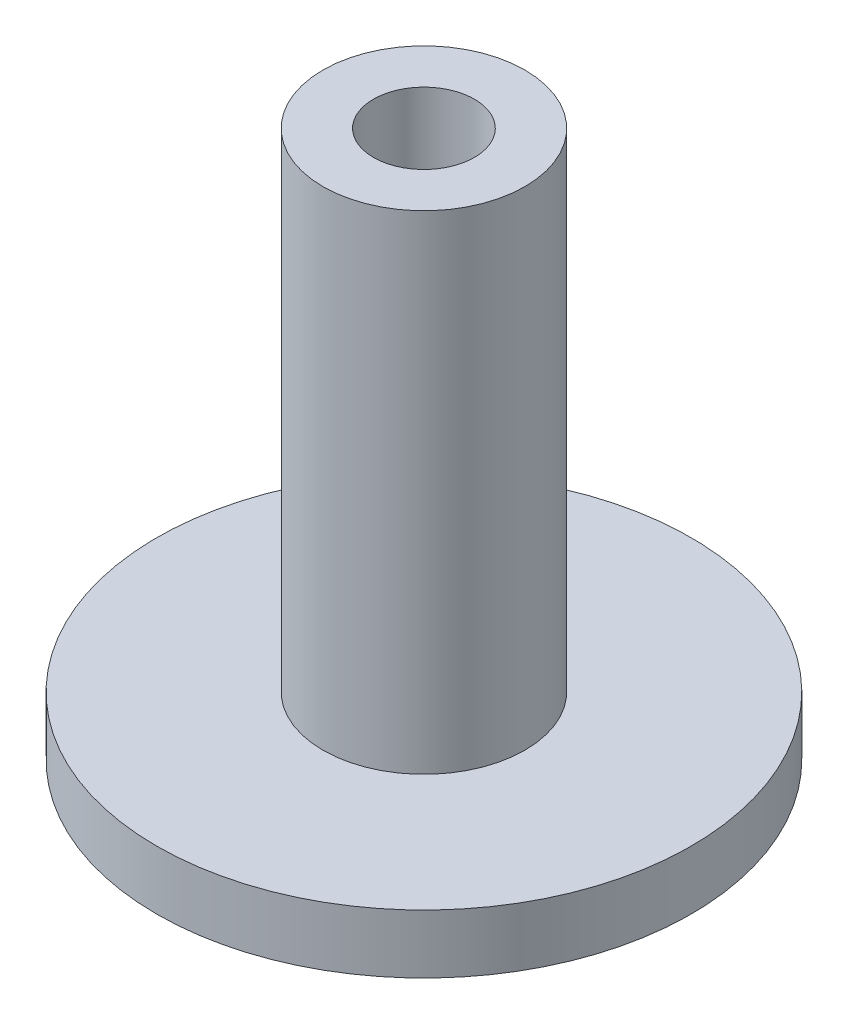
ISO-10303-21;
HEADER;
FILE_DESCRIPTION(('STEP AP214'),'2;1');
FILE_NAME('part.step','',(''),(''),'','','');
FILE_SCHEMA(('AUTOMOTIVE_DESIGN { 1 0 10303 214 1 1 1 1 }'));
ENDSEC;
DATA;
#1=APPLICATION_CONTEXT('core data for automotive mechanical design processes');
#2=APPLICATION_PROTOCOL_DEFINITION('international standard','automotive_design',2000,#1);
#3=PRODUCT_CONTEXT('',#1,'mechanical');
#4=PRODUCT('Part','Part','',(#3));
#5=PRODUCT_RELATED_PRODUCT_CATEGORY('part','',(#4));
#6=PRODUCT_DEFINITION_FORMATION('','',#4);
#7=PRODUCT_DEFINITION_CONTEXT('part definition',#1,'design');
#8=PRODUCT_DEFINITION('design','',#6,#7);
#9=PRODUCT_DEFINITION_SHAPE('','',#8);
#10=(LENGTH_UNIT() NAMED_UNIT(*) SI_UNIT(.MILLI.,.METRE.));
#11=(NAMED_UNIT(*) PLANE_ANGLE_UNIT() SI_UNIT($,.RADIAN.));
#12=(NAMED_UNIT(*) SI_UNIT($,.STERADIAN.) SOLID_ANGLE_UNIT());
#13=UNCERTAINTY_MEASURE_WITH_UNIT(LENGTH_MEASURE(1.E-05),#10,'distance_accuracy_value','');
#14=(GEOMETRIC_REPRESENTATION_CONTEXT(3) GLOBAL_UNCERTAINTY_ASSIGNED_CONTEXT((#13)) GLOBAL_UNIT_ASSIGNED_CONTEXT((#10,
#11,#12)) REPRESENTATION_CONTEXT('',''));
#15=CARTESIAN_POINT('',(0.,0.,0.));
#16=DIRECTION('',(0.,0.,1.));
#17=DIRECTION('',(1.,0.,0.));
#18=AXIS2_PLACEMENT_3D('',#15,#16,#17);
#19=CARTESIAN_POINT('',(0.,1.4,0.));
#20=DIRECTION('',(0.,-1.,0.));
#21=DIRECTION('',(0.,0.,-1.));
#22=AXIS2_PLACEMENT_3D('',#19,#20,#21);
#23=CYLINDRICAL_SURFACE('',#22,6.35);
#24=CARTESIAN_POINT('',(0.,1.4,0.));
#25=DIRECTION('',(0.,1.,0.));
#26=DIRECTION('',(0.,0.,1.));
#27=AXIS2_PLACEMENT_3D('',#24,#25,#26);
#28=CIRCLE('',#27,6.35);
#29=CARTESIAN_POINT('',(0.,1.4,6.35));
#30=VERTEX_POINT('',#29);
#31=EDGE_CURVE('E37',#30,#30,#28,.T.);
#32=ORIENTED_EDGE('',*,*,#31,.F.);
#33=EDGE_LOOP('',(#32));
#34=FACE_BOUND('',#33,.T.);
#35=CARTESIAN_POINT('',(0.,0.,0.));
#36=DIRECTION('',(0.,1.,0.));
#37=DIRECTION('',(0.,0.,1.));
#38=AXIS2_PLACEMENT_3D('',#35,#36,#37);
#39=CIRCLE('',#38,6.35);
#40=CARTESIAN_POINT('',(0.,0.,6.35));
#41=VERTEX_POINT('',#40);
#42=EDGE_CURVE('E33',#41,#41,#39,.T.);
#43=ORIENTED_EDGE('',*,*,#42,.T.);
#44=EDGE_LOOP('',(#43));
#45=FACE_BOUND('',#44,.T.);
#46=ADVANCED_FACE('F30',(#34,#45),#23,.T.);
#47=CARTESIAN_POINT('',(0.,1.4,0.));
#48=DIRECTION('',(0.,1.,0.));
#49=DIRECTION('',(0.,0.,1.));
#50=AXIS2_PLACEMENT_3D('',#47,#48,#49);
#51=PLANE('',#50);
#52=CARTESIAN_POINT('',(0.,1.4,0.));
#53=DIRECTION('',(0.,1.,0.));
#54=DIRECTION('',(0.,0.,1.));
#55=AXIS2_PLACEMENT_3D('',#52,#53,#54);
#56=CIRCLE('',#55,2.4);
#57=CARTESIAN_POINT('',(0.,1.4,2.4));
#58=VERTEX_POINT('',#57);
#59=EDGE_CURVE('E10',#58,#58,#56,.T.);
#60=ORIENTED_EDGE('',*,*,#59,.F.);
#61=EDGE_LOOP('',(#60));
#62=FACE_BOUND('',#61,.T.);
#63=ORIENTED_EDGE('',*,*,#31,.T.);
#64=EDGE_LOOP('',(#63));
#65=FACE_BOUND('',#64,.T.);
#66=ADVANCED_FACE('F74',(#62,#65),#51,.T.);
#67=CARTESIAN_POINT('',(0.,0.,0.));
#68=DIRECTION('',(0.,1.,0.));
#69=DIRECTION('',(0.,0.,1.));
#70=AXIS2_PLACEMENT_3D('',#67,#68,#69);
#71=PLANE('',#70);
#72=CARTESIAN_POINT('',(0.,0.,0.));
#73=DIRECTION('',(0.,1.,0.));
#74=DIRECTION('',(0.,0.,1.));
#75=AXIS2_PLACEMENT_3D('',#72,#73,#74);
#76=CIRCLE('',#75,1.2);
#77=CARTESIAN_POINT('',(0.,0.,1.2));
#78=VERTEX_POINT('',#77);
#79=EDGE_CURVE('E46',#78,#78,#76,.T.);
#80=ORIENTED_EDGE('',*,*,#79,.T.);
#81=EDGE_LOOP('',(#80));
#82=FACE_BOUND('',#81,.T.);
#83=ORIENTED_EDGE('',*,*,#42,.F.);
#84=EDGE_LOOP('',(#83));
#85=FACE_BOUND('',#84,.T.);
#86=ADVANCED_FACE('F53',(#82,#85),#71,.F.);
#87=CARTESIAN_POINT('',(0.,13.,0.));
#88=DIRECTION('',(0.,-1.,0.));
#89=DIRECTION('',(0.,0.,-1.));
#90=AXIS2_PLACEMENT_3D('',#87,#88,#89);
#91=CYLINDRICAL_SURFACE('',#90,2.4);
#92=CARTESIAN_POINT('',(0.,13.,0.));
#93=DIRECTION('',(0.,1.,0.));
#94=DIRECTION('',(0.,0.,1.));
#95=AXIS2_PLACEMENT_3D('',#92,#93,#94);
#96=CIRCLE('',#95,2.4);
#97=CARTESIAN_POINT('',(0.,13.,2.4));
#98=VERTEX_POINT('',#97);
#99=EDGE_CURVE('E43',#98,#98,#96,.T.);
#100=ORIENTED_EDGE('',*,*,#99,.F.);
#101=EDGE_LOOP('',(#100));
#102=FACE_BOUND('',#101,.T.);
#103=ORIENTED_EDGE('',*,*,#59,.T.);
#104=EDGE_LOOP('',(#103));
#105=FACE_BOUND('',#104,.T.);
#106=ADVANCED_FACE('F65',(#102,#105),#91,.T.);
#107=CARTESIAN_POINT('',(0.,13.,0.));
#108=DIRECTION('',(0.,1.,0.));
#109=DIRECTION('',(0.,0.,1.));
#110=AXIS2_PLACEMENT_3D('',#107,#108,#109);
#111=PLANE('',#110);
#112=CARTESIAN_POINT('',(0.,13.,0.));
#113=DIRECTION('',(0.,1.,0.));
#114=DIRECTION('',(0.,0.,1.));
#115=AXIS2_PLACEMENT_3D('',#112,#113,#114);
#116=CIRCLE('',#115,1.2);
#117=CARTESIAN_POINT('',(0.,13.,1.2));
#118=VERTEX_POINT('',#117);
#119=EDGE_CURVE('E47',#118,#118,#116,.T.);
#120=ORIENTED_EDGE('',*,*,#119,.F.);
#121=EDGE_LOOP('',(#120));
#122=FACE_BOUND('',#121,.T.);
#123=ORIENTED_EDGE('',*,*,#99,.T.);
#124=EDGE_LOOP('',(#123));
#125=FACE_BOUND('',#124,.T.);
#126=ADVANCED_FACE('F59',(#122,#125),#111,.T.);
#127=CARTESIAN_POINT('',(0.,0.,0.));
#128=DIRECTION('',(0.,1.,0.));
#129=DIRECTION('',(0.,0.,1.));
#130=AXIS2_PLACEMENT_3D('',#127,#128,#129);
#131=CYLINDRICAL_SURFACE('',#130,1.2);
#132=CARTESIAN_POINT('',(0.,0.,1.2));
#133=CARTESIAN_POINT('',(0.,0.135416666666666,1.2));
#134=CARTESIAN_POINT('',(0.,0.270833333333333,1.2));
#135=CARTESIAN_POINT('',(0.,0.541666666666667,1.2));
#136=CARTESIAN_POINT('',(0.,0.677083333333333,1.2));
#137=CARTESIAN_POINT('',(0.,0.947916666666667,1.2));
#138=CARTESIAN_POINT('',(0.,1.08333333333333,1.2));
#139=CARTESIAN_POINT('',(0.,1.35416666666667,1.2));
#140=CARTESIAN_POINT('',(0.,1.48958333333333,1.2));
#141=CARTESIAN_POINT('',(0.,1.76041666666667,1.2));
#142=CARTESIAN_POINT('',(0.,1.89583333333333,1.2));
#143=CARTESIAN_POINT('',(0.,2.16666666666667,1.2));
#144=CARTESIAN_POINT('',(0.,2.30208333333333,1.2));
#145=CARTESIAN_POINT('',(0.,2.57291666666667,1.2));
#146=CARTESIAN_POINT('',(0.,2.70833333333333,1.2));
#147=CARTESIAN_POINT('',(0.,2.97916666666667,1.2));
#148=CARTESIAN_POINT('',(0.,3.11458333333333,1.2));
#149=CARTESIAN_POINT('',(0.,3.38541666666667,1.2));
#150=CARTESIAN_POINT('',(0.,3.52083333333333,1.2));
#151=CARTESIAN_POINT('',(0.,3.79166666666667,1.2));
#152=CARTESIAN_POINT('',(0.,3.92708333333333,1.2));
#153=CARTESIAN_POINT('',(0.,4.19791666666667,1.2));
#154=CARTESIAN_POINT('',(0.,4.33333333333333,1.2));
#155=CARTESIAN_POINT('',(0.,4.60416666666667,1.2));
#156=CARTESIAN_POINT('',(0.,4.73958333333333,1.2));
#157=CARTESIAN_POINT('',(0.,5.01041666666667,1.2));
#158=CARTESIAN_POINT('',(0.,5.14583333333333,1.2));
#159=CARTESIAN_POINT('',(0.,5.41666666666667,1.2));
#160=CARTESIAN_POINT('',(0.,5.55208333333333,1.2));
#161=CARTESIAN_POINT('',(0.,5.82291666666667,1.2));
#162=CARTESIAN_POINT('',(0.,5.95833333333333,1.2));
#163=CARTESIAN_POINT('',(0.,6.22916666666667,1.2));
#164=CARTESIAN_POINT('',(0.,6.36458333333333,1.2));
#165=CARTESIAN_POINT('',(0.,6.63541666666667,1.2));
#166=CARTESIAN_POINT('',(0.,6.77083333333333,1.2));
#167=CARTESIAN_POINT('',(0.,7.04166666666667,1.2));
#168=CARTESIAN_POINT('',(0.,7.17708333333333,1.2));
#169=CARTESIAN_POINT('',(0.,7.44791666666667,1.2));
#170=CARTESIAN_POINT('',(0.,7.58333333333333,1.2));
#171=CARTESIAN_POINT('',(0.,7.85416666666667,1.2));
#172=CARTESIAN_POINT('',(0.,7.98958333333333,1.2));
#173=CARTESIAN_POINT('',(0.,8.26041666666667,1.2));
#174=CARTESIAN_POINT('',(0.,8.39583333333333,1.2));
#175=CARTESIAN_POINT('',(0.,8.66666666666667,1.2));
#176=CARTESIAN_POINT('',(0.,8.80208333333333,1.2));
#177=CARTESIAN_POINT('',(0.,9.07291666666667,1.2));
#178=CARTESIAN_POINT('',(0.,9.20833333333333,1.2));
#179=CARTESIAN_POINT('',(0.,9.47916666666667,1.2));
#180=CARTESIAN_POINT('',(0.,9.61458333333333,1.2));
#181=CARTESIAN_POINT('',(0.,9.88541666666667,1.2));
#182=CARTESIAN_POINT('',(0.,10.0208333333333,1.2));
#183=CARTESIAN_POINT('',(0.,10.2916666666667,1.2));
#184=CARTESIAN_POINT('',(0.,10.4270833333333,1.2));
#185=CARTESIAN_POINT('',(0.,10.6979166666667,1.2));
#186=CARTESIAN_POINT('',(0.,10.8333333333333,1.2));
#187=CARTESIAN_POINT('',(0.,11.1041666666667,1.2));
#188=CARTESIAN_POINT('',(0.,11.2395833333333,1.2));
#189=CARTESIAN_POINT('',(0.,11.5104166666667,1.2));
#190=CARTESIAN_POINT('',(0.,11.6458333333333,1.2));
#191=CARTESIAN_POINT('',(0.,11.9166666666667,1.2));
#192=CARTESIAN_POINT('',(0.,12.0520833333333,1.2));
#193=CARTESIAN_POINT('',(0.,12.3229166666667,1.2));
#194=CARTESIAN_POINT('',(0.,12.4583333333333,1.2));
#195=CARTESIAN_POINT('',(0.,12.7291666666667,1.2));
#196=CARTESIAN_POINT('',(0.,12.8645833333333,1.2));
#197=CARTESIAN_POINT('',(0.,13.,1.2));
#198=B_SPLINE_CURVE_WITH_KNOTS('',3,(#132,#133,#134,#135,#136,#137,#138,#139,#140,#141,#142,
#143,#144,#145,#146,#147,#148,#149,#150,#151,#152,#153,#154,#155,#156,#157,#158,#159,#160,#161,
#162,#163,#164,#165,#166,#167,#168,#169,#170,#171,#172,#173,#174,#175,#176,#177,#178,#179,#180,
#181,#182,#183,#184,#185,#186,#187,#188,#189,#190,#191,#192,#193,#194,#195,#196,#197),
.UNSPECIFIED.,.F.,.F.,(4,2,2,2,2,2,2,2,2,2,2,2,2,2,2,2,2,2,2,2,2,2,2,2,2,2,2,2,2,2,2,2,4),(0.,
0.40625,0.8125,1.21875,1.625,2.03125,2.4375,2.84375,3.25,3.65625,4.0625,4.46875,4.875,5.28125,
5.6875,6.09375,6.5,6.90625,7.3125,7.71875,8.125,8.53125,8.9375,9.34375,9.75,10.15625,10.5625,
10.96875,11.375,11.78125,12.1875,12.59375,13.),.UNSPECIFIED.);
#199=EDGE_CURVE('BSEAM56',#78,#118,#198,.T.);
#200=ORIENTED_EDGE('',*,*,#79,.F.);
#201=ORIENTED_EDGE('',*,*,#119,.T.);
#202=ORIENTED_EDGE('',*,*,#199,.T.);
#203=ORIENTED_EDGE('',*,*,#199,.F.);
#204=EDGE_LOOP('',(#200,#202,#201,#203));
#205=FACE_BOUND('',#204,.T.);
#206=ADVANCED_FACE('F56',(#205),#131,.F.);
#207=CLOSED_SHELL('',(#46,#66,#86,#106,#126,#206));
#208=MANIFOLD_SOLID_BREP('B2',#207);
#209=ADVANCED_BREP_SHAPE_REPRESENTATION('',(#18,#208),#14);
#210=SHAPE_DEFINITION_REPRESENTATION(#9,#209);
ENDSEC;
END-ISO-10303-21;
